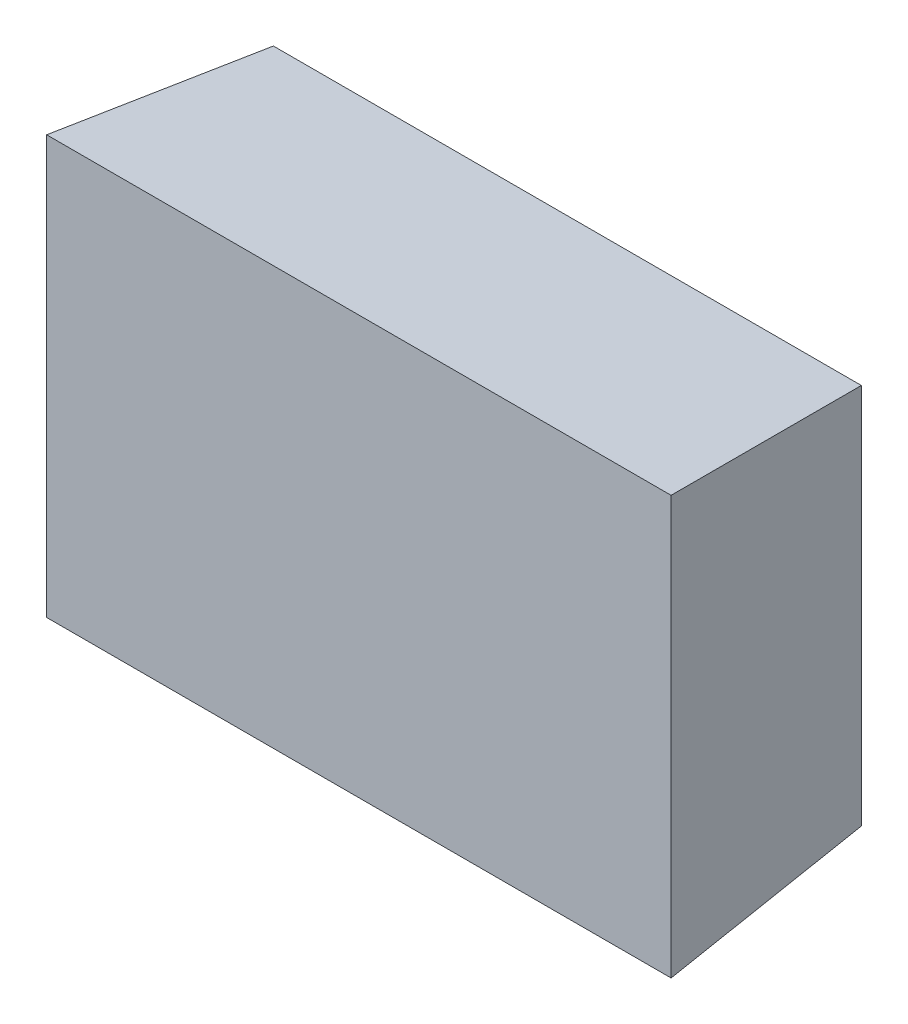
ISO-10303-21;
HEADER;
FILE_DESCRIPTION(('STEP AP214'),'2;1');
FILE_NAME('part.step','',(''),(''),'','','');
FILE_SCHEMA(('AUTOMOTIVE_DESIGN { 1 0 10303 214 1 1 1 1 }'));
ENDSEC;
DATA;
#1=APPLICATION_CONTEXT('core data for automotive mechanical design processes');
#2=APPLICATION_PROTOCOL_DEFINITION('international standard','automotive_design',2000,#1);
#3=PRODUCT_CONTEXT('',#1,'mechanical');
#4=PRODUCT('Part','Part','',(#3));
#5=PRODUCT_RELATED_PRODUCT_CATEGORY('part','',(#4));
#6=PRODUCT_DEFINITION_FORMATION('','',#4);
#7=PRODUCT_DEFINITION_CONTEXT('part definition',#1,'design');
#8=PRODUCT_DEFINITION('design','',#6,#7);
#9=PRODUCT_DEFINITION_SHAPE('','',#8);
#10=(LENGTH_UNIT() NAMED_UNIT(*) SI_UNIT(.MILLI.,.METRE.));
#11=(NAMED_UNIT(*) PLANE_ANGLE_UNIT() SI_UNIT($,.RADIAN.));
#12=(NAMED_UNIT(*) SI_UNIT($,.STERADIAN.) SOLID_ANGLE_UNIT());
#13=UNCERTAINTY_MEASURE_WITH_UNIT(LENGTH_MEASURE(1.E-05),#10,'distance_accuracy_value','');
#14=(GEOMETRIC_REPRESENTATION_CONTEXT(3) GLOBAL_UNCERTAINTY_ASSIGNED_CONTEXT((#13)) GLOBAL_UNIT_ASSIGNED_CONTEXT((#10,
#11,#12)) REPRESENTATION_CONTEXT('',''));
#15=CARTESIAN_POINT('',(0.,0.,0.));
#16=DIRECTION('',(0.,0.,1.));
#17=DIRECTION('',(1.,0.,0.));
#18=AXIS2_PLACEMENT_3D('',#15,#16,#17);
#19=CARTESIAN_POINT('',(0.,0.,-0.605));
#20=DIRECTION('',(0.,0.,-1.));
#21=DIRECTION('',(1.,0.,0.));
#22=AXIS2_PLACEMENT_3D('',#19,#20,#21);
#23=PLANE('',#22);
#24=DIRECTION('',(0.,1.,0.));
#25=VECTOR('',#24,1.);
#26=CARTESIAN_POINT('',(-0.564004534589649,0.401,-0.604999999999969));
#27=LINE('',#26,#25);
#28=CARTESIAN_POINT('',(-0.564004534589912,-0.366004534589912,-0.604999999999985));
#29=VERTEX_POINT('',#28);
#30=CARTESIAN_POINT('',(-0.564004534589912,0.366004534589912,-0.604999999999985));
#31=VERTEX_POINT('',#30);
#32=EDGE_CURVE('E40',#29,#31,#27,.T.);
#33=ORIENTED_EDGE('',*,*,#32,.T.);
#34=DIRECTION('',(1.,0.,0.));
#35=VECTOR('',#34,1.);
#36=CARTESIAN_POINT('',(-0.599,0.366004534589649,-0.604999999999969));
#37=LINE('',#36,#35);
#38=CARTESIAN_POINT('',(0.564004534589912,0.366004534589912,-0.604999999999985));
#39=VERTEX_POINT('',#38);
#40=EDGE_CURVE('E99',#31,#39,#37,.T.);
#41=ORIENTED_EDGE('',*,*,#40,.T.);
#42=DIRECTION('',(0.,1.,0.));
#43=VECTOR('',#42,1.);
#44=CARTESIAN_POINT('',(0.564004534589649,0.401,-0.604999999999969));
#45=LINE('',#44,#43);
#46=CARTESIAN_POINT('',(0.564004534589912,-0.366004534589912,-0.604999999999985));
#47=VERTEX_POINT('',#46);
#48=EDGE_CURVE('E88',#39,#47,#45,.F.);
#49=ORIENTED_EDGE('',*,*,#48,.T.);
#50=DIRECTION('',(1.,0.,0.));
#51=VECTOR('',#50,1.);
#52=CARTESIAN_POINT('',(-0.599,-0.366004534589649,-0.604999999999969));
#53=LINE('',#52,#51);
#54=EDGE_CURVE('E80',#47,#29,#53,.F.);
#55=ORIENTED_EDGE('',*,*,#54,.T.);
#56=EDGE_LOOP('',(#33,#41,#49,#55));
#57=FACE_BOUND('',#56,.T.);
#58=ADVANCED_FACE('F37',(#57),#23,.T.);
#59=CARTESIAN_POINT('',(-0.599,0.401,-0.205));
#60=DIRECTION('',(-0.996194698091749,0.,-0.0871557427476181));
#61=DIRECTION('',(0.0871557427476181,0.,-0.996194698091749));
#62=AXIS2_PLACEMENT_3D('',#59,#60,#61);
#63=PLANE('',#62);
#64=DIRECTION('',(0.,1.,0.));
#65=VECTOR('',#64,1.);
#66=CARTESIAN_POINT('',(-0.599,0.,-0.205));
#67=LINE('',#66,#65);
#68=CARTESIAN_POINT('',(-0.599,0.401,-0.205));
#69=VERTEX_POINT('',#68);
#70=CARTESIAN_POINT('',(-0.599,-0.401,-0.205));
#71=VERTEX_POINT('',#70);
#72=EDGE_CURVE('E96',#69,#71,#67,.F.);
#73=ORIENTED_EDGE('',*,*,#72,.F.);
#74=DIRECTION('',(0.0868265938633445,-0.0868265938642145,-0.992432509139049));
#75=VECTOR('',#74,1.);
#76=CARTESIAN_POINT('',(-0.599,0.401,-0.205));
#77=LINE('',#76,#75);
#78=EDGE_CURVE('E94',#69,#31,#77,.T.);
#79=ORIENTED_EDGE('',*,*,#78,.T.);
#80=ORIENTED_EDGE('',*,*,#32,.F.);
#81=DIRECTION('',(-0.0868265938633445,-0.0868265938642145,0.992432509139049));
#82=VECTOR('',#81,1.);
#83=CARTESIAN_POINT('',(-0.56400453459,-0.366004534589649,-0.604999999999969));
#84=LINE('',#83,#82);
#85=EDGE_CURVE('E77',#29,#71,#84,.T.);
#86=ORIENTED_EDGE('',*,*,#85,.T.);
#87=EDGE_LOOP('',(#73,#79,#80,#86));
#88=FACE_BOUND('',#87,.T.);
#89=ADVANCED_FACE('F93',(#88),#63,.T.);
#90=CARTESIAN_POINT('',(-0.599,-0.401,-0.205));
#91=DIRECTION('',(0.,-0.996194698091749,-0.0871557427476181));
#92=DIRECTION('',(0.,-0.0871557427476181,0.996194698091749));
#93=AXIS2_PLACEMENT_3D('',#90,#91,#92);
#94=PLANE('',#93);
#95=DIRECTION('',(1.,0.,0.));
#96=VECTOR('',#95,1.);
#97=CARTESIAN_POINT('',(0.,-0.401,-0.205));
#98=LINE('',#97,#96);
#99=CARTESIAN_POINT('',(0.599,-0.401,-0.205));
#100=VERTEX_POINT('',#99);
#101=EDGE_CURVE('E83',#71,#100,#98,.T.);
#102=ORIENTED_EDGE('',*,*,#101,.F.);
#103=ORIENTED_EDGE('',*,*,#85,.F.);
#104=ORIENTED_EDGE('',*,*,#54,.F.);
#105=DIRECTION('',(0.0868265938642145,-0.0868265938633445,0.992432509139049));
#106=VECTOR('',#105,1.);
#107=CARTESIAN_POINT('',(0.564004534589649,-0.36600453459,-0.604999999999969));
#108=LINE('',#107,#106);
#109=EDGE_CURVE('E72',#47,#100,#108,.T.);
#110=ORIENTED_EDGE('',*,*,#109,.T.);
#111=EDGE_LOOP('',(#102,#103,#104,#110));
#112=FACE_BOUND('',#111,.T.);
#113=ADVANCED_FACE('F79',(#112),#94,.T.);
#114=CARTESIAN_POINT('',(0.599,0.401,-0.205));
#115=DIRECTION('',(0.996194698091749,0.,-0.0871557427476181));
#116=DIRECTION('',(0.0871557427476181,0.,0.996194698091749));
#117=AXIS2_PLACEMENT_3D('',#114,#115,#116);
#118=PLANE('',#117);
#119=DIRECTION('',(0.,1.,0.));
#120=VECTOR('',#119,1.);
#121=CARTESIAN_POINT('',(0.599,0.,-0.205));
#122=LINE('',#121,#120);
#123=CARTESIAN_POINT('',(0.599,0.401,-0.205));
#124=VERTEX_POINT('',#123);
#125=EDGE_CURVE('E46',#100,#124,#122,.T.);
#126=ORIENTED_EDGE('',*,*,#125,.F.);
#127=ORIENTED_EDGE('',*,*,#109,.F.);
#128=ORIENTED_EDGE('',*,*,#48,.F.);
#129=DIRECTION('',(0.0868265938633448,0.0868265938642145,0.992432509139049));
#130=VECTOR('',#129,1.);
#131=CARTESIAN_POINT('',(0.56400453459,0.366004534589649,-0.604999999999969));
#132=LINE('',#131,#130);
#133=EDGE_CURVE('E97',#39,#124,#132,.T.);
#134=ORIENTED_EDGE('',*,*,#133,.T.);
#135=EDGE_LOOP('',(#126,#127,#128,#134));
#136=FACE_BOUND('',#135,.T.);
#137=ADVANCED_FACE('F111',(#136),#118,.T.);
#138=CARTESIAN_POINT('',(-0.599,0.401,-0.205));
#139=DIRECTION('',(0.,0.996194698091749,-0.0871557427476181));
#140=DIRECTION('',(0.,-0.0871557427476181,-0.996194698091749));
#141=AXIS2_PLACEMENT_3D('',#138,#139,#140);
#142=PLANE('',#141);
#143=DIRECTION('',(1.,0.,0.));
#144=VECTOR('',#143,1.);
#145=CARTESIAN_POINT('',(0.,0.401,-0.205));
#146=LINE('',#145,#144);
#147=EDGE_CURVE('E11',#124,#69,#146,.F.);
#148=ORIENTED_EDGE('',*,*,#147,.F.);
#149=ORIENTED_EDGE('',*,*,#133,.F.);
#150=ORIENTED_EDGE('',*,*,#40,.F.);
#151=ORIENTED_EDGE('',*,*,#78,.F.);
#152=EDGE_LOOP('',(#148,#149,#150,#151));
#153=FACE_BOUND('',#152,.T.);
#154=ADVANCED_FACE('F100',(#153),#142,.T.);
#155=CARTESIAN_POINT('',(0.,0.,-0.205));
#156=DIRECTION('',(0.,0.,-1.));
#157=DIRECTION('',(1.,0.,0.));
#158=AXIS2_PLACEMENT_3D('',#155,#156,#157);
#159=PLANE('',#158);
#160=ORIENTED_EDGE('',*,*,#125,.T.);
#161=ORIENTED_EDGE('',*,*,#147,.T.);
#162=ORIENTED_EDGE('',*,*,#72,.T.);
#163=ORIENTED_EDGE('',*,*,#101,.T.);
#164=EDGE_LOOP('',(#160,#161,#162,#163));
#165=FACE_BOUND('',#164,.T.);
#166=ADVANCED_FACE('F110',(#165),#159,.F.);
#167=CLOSED_SHELL('',(#58,#89,#113,#137,#154,#166));
#168=MANIFOLD_SOLID_BREP('B2',#167);
#169=ADVANCED_BREP_SHAPE_REPRESENTATION('',(#18,#168),#14);
#170=SHAPE_DEFINITION_REPRESENTATION(#9,#169);
ENDSEC;
END-ISO-10303-21;
